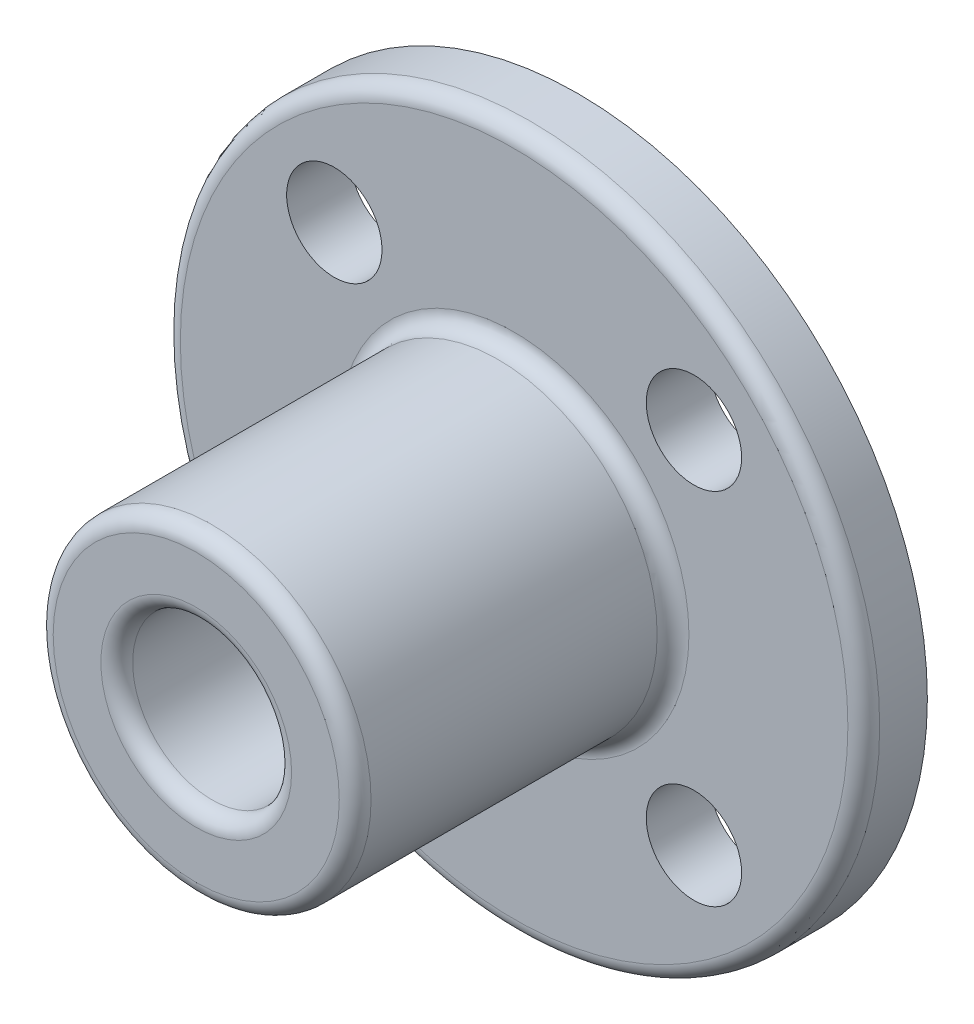
ISO-10303-21;
HEADER;
FILE_DESCRIPTION(('STEP AP214'),'2;1');
FILE_NAME('part.step','',(''),(''),'','','');
FILE_SCHEMA(('AUTOMOTIVE_DESIGN { 1 0 10303 214 1 1 1 1 }'));
ENDSEC;
DATA;
#1=APPLICATION_CONTEXT('core data for automotive mechanical design processes');
#2=APPLICATION_PROTOCOL_DEFINITION('international standard','automotive_design',2000,#1);
#3=PRODUCT_CONTEXT('',#1,'mechanical');
#4=PRODUCT('Part','Part','',(#3));
#5=PRODUCT_RELATED_PRODUCT_CATEGORY('part','',(#4));
#6=PRODUCT_DEFINITION_FORMATION('','',#4);
#7=PRODUCT_DEFINITION_CONTEXT('part definition',#1,'design');
#8=PRODUCT_DEFINITION('design','',#6,#7);
#9=PRODUCT_DEFINITION_SHAPE('','',#8);
#10=(LENGTH_UNIT() NAMED_UNIT(*) SI_UNIT(.MILLI.,.METRE.));
#11=(NAMED_UNIT(*) PLANE_ANGLE_UNIT() SI_UNIT($,.RADIAN.));
#12=(NAMED_UNIT(*) SI_UNIT($,.STERADIAN.) SOLID_ANGLE_UNIT());
#13=UNCERTAINTY_MEASURE_WITH_UNIT(LENGTH_MEASURE(1.E-05),#10,'distance_accuracy_value','');
#14=(GEOMETRIC_REPRESENTATION_CONTEXT(3) GLOBAL_UNCERTAINTY_ASSIGNED_CONTEXT((#13)) GLOBAL_UNIT_ASSIGNED_CONTEXT((#10,
#11,#12)) REPRESENTATION_CONTEXT('',''));
#15=CARTESIAN_POINT('',(0.,0.,0.));
#16=DIRECTION('',(0.,0.,1.));
#17=DIRECTION('',(1.,0.,0.));
#18=AXIS2_PLACEMENT_3D('',#15,#16,#17);
#19=CARTESIAN_POINT('',(0.,0.,2.));
#20=DIRECTION('',(0.,0.,1.));
#21=DIRECTION('',(1.,0.,0.));
#22=AXIS2_PLACEMENT_3D('',#19,#20,#21);
#23=PLANE('',#22);
#24=CARTESIAN_POINT('',(0.,0.,2.));
#25=DIRECTION('',(0.,0.,1.));
#26=DIRECTION('',(1.,0.,0.));
#27=AXIS2_PLACEMENT_3D('',#24,#25,#26);
#28=CIRCLE('',#27,10.5);
#29=CARTESIAN_POINT('',(10.5,0.,2.));
#30=VERTEX_POINT('',#29);
#31=EDGE_CURVE('E63',#30,#30,#28,.T.);
#32=ORIENTED_EDGE('',*,*,#31,.T.);
#33=EDGE_LOOP('',(#32));
#34=FACE_BOUND('',#33,.T.);
#35=CARTESIAN_POINT('',(0.,0.,2.));
#36=DIRECTION('',(0.,0.,1.));
#37=DIRECTION('',(1.,0.,0.));
#38=AXIS2_PLACEMENT_3D('',#35,#36,#37);
#39=CIRCLE('',#38,5.5);
#40=CARTESIAN_POINT('',(5.5,0.,2.));
#41=VERTEX_POINT('',#40);
#42=EDGE_CURVE('E66',#41,#41,#39,.F.);
#43=ORIENTED_EDGE('',*,*,#42,.T.);
#44=EDGE_LOOP('',(#43));
#45=FACE_BOUND('',#44,.T.);
#46=CARTESIAN_POINT('',(-5.65599974191922,-5.65770862800566,2.));
#47=DIRECTION('',(0.,0.,1.));
#48=DIRECTION('',(1.,0.,0.));
#49=AXIS2_PLACEMENT_3D('',#46,#47,#48);
#50=CIRCLE('',#49,1.5);
#51=CARTESIAN_POINT('',(-4.15599974191922,-5.65770862800566,2.));
#52=VERTEX_POINT('',#51);
#53=EDGE_CURVE('E91',#52,#52,#50,.T.);
#54=ORIENTED_EDGE('',*,*,#53,.F.);
#55=EDGE_LOOP('',(#54));
#56=FACE_BOUND('',#55,.T.);
#57=CARTESIAN_POINT('',(5.65599974191922,5.65770862800566,2.));
#58=DIRECTION('',(0.,0.,1.));
#59=DIRECTION('',(1.,0.,0.));
#60=AXIS2_PLACEMENT_3D('',#57,#58,#59);
#61=CIRCLE('',#60,1.5);
#62=CARTESIAN_POINT('',(7.15599974191922,5.65770862800566,2.));
#63=VERTEX_POINT('',#62);
#64=EDGE_CURVE('E79',#63,#63,#61,.T.);
#65=ORIENTED_EDGE('',*,*,#64,.F.);
#66=EDGE_LOOP('',(#65));
#67=FACE_BOUND('',#66,.T.);
#68=CARTESIAN_POINT('',(-5.65599974191922,5.65770862800566,2.));
#69=DIRECTION('',(0.,0.,1.));
#70=DIRECTION('',(1.,0.,0.));
#71=AXIS2_PLACEMENT_3D('',#68,#69,#70);
#72=CIRCLE('',#71,1.5);
#73=CARTESIAN_POINT('',(-4.15599974191922,5.65770862800566,2.));
#74=VERTEX_POINT('',#73);
#75=EDGE_CURVE('E75',#74,#74,#72,.T.);
#76=ORIENTED_EDGE('',*,*,#75,.F.);
#77=EDGE_LOOP('',(#76));
#78=FACE_BOUND('',#77,.T.);
#79=CARTESIAN_POINT('',(5.65599974191922,-5.65770862800566,2.));
#80=DIRECTION('',(0.,0.,1.));
#81=DIRECTION('',(1.,0.,0.));
#82=AXIS2_PLACEMENT_3D('',#79,#80,#81);
#83=CIRCLE('',#82,1.5);
#84=CARTESIAN_POINT('',(7.15599974191922,-5.65770862800566,2.));
#85=VERTEX_POINT('',#84);
#86=EDGE_CURVE('E85',#85,#85,#83,.T.);
#87=ORIENTED_EDGE('',*,*,#86,.F.);
#88=EDGE_LOOP('',(#87));
#89=FACE_BOUND('',#88,.T.);
#90=ADVANCED_FACE('F37',(#34,#45,#56,#67,#78,#89),#23,.T.);
#91=CARTESIAN_POINT('',(0.,0.,0.));
#92=DIRECTION('',(0.,0.,1.));
#93=DIRECTION('',(1.,0.,0.));
#94=AXIS2_PLACEMENT_3D('',#91,#92,#93);
#95=PLANE('',#94);
#96=CARTESIAN_POINT('',(0.,0.,0.));
#97=DIRECTION('',(0.,0.,1.));
#98=DIRECTION('',(1.,0.,0.));
#99=AXIS2_PLACEMENT_3D('',#96,#97,#98);
#100=CIRCLE('',#99,11.);
#101=CARTESIAN_POINT('',(11.,0.,0.));
#102=VERTEX_POINT('',#101);
#103=EDGE_CURVE('E69',#102,#102,#100,.T.);
#104=ORIENTED_EDGE('',*,*,#103,.F.);
#105=EDGE_LOOP('',(#104));
#106=FACE_BOUND('',#105,.T.);
#107=CARTESIAN_POINT('',(0.,0.,0.));
#108=DIRECTION('',(0.,0.,1.));
#109=DIRECTION('',(1.,0.,0.));
#110=AXIS2_PLACEMENT_3D('',#107,#108,#109);
#111=CIRCLE('',#110,2.5);
#112=CARTESIAN_POINT('',(2.5,0.,0.));
#113=VERTEX_POINT('',#112);
#114=EDGE_CURVE('E72',#113,#113,#111,.T.);
#115=ORIENTED_EDGE('',*,*,#114,.T.);
#116=EDGE_LOOP('',(#115));
#117=FACE_BOUND('',#116,.T.);
#118=CARTESIAN_POINT('',(-5.65599974191922,5.65770862800566,0.));
#119=DIRECTION('',(0.,0.,1.));
#120=DIRECTION('',(1.,0.,0.));
#121=AXIS2_PLACEMENT_3D('',#118,#119,#120);
#122=CIRCLE('',#121,1.5);
#123=CARTESIAN_POINT('',(-4.15599974191922,5.65770862800566,0.));
#124=VERTEX_POINT('',#123);
#125=EDGE_CURVE('E76',#124,#124,#122,.T.);
#126=ORIENTED_EDGE('',*,*,#125,.T.);
#127=EDGE_LOOP('',(#126));
#128=FACE_BOUND('',#127,.T.);
#129=CARTESIAN_POINT('',(5.65599974191922,5.65770862800566,0.));
#130=DIRECTION('',(0.,0.,1.));
#131=DIRECTION('',(1.,0.,0.));
#132=AXIS2_PLACEMENT_3D('',#129,#130,#131);
#133=CIRCLE('',#132,1.5);
#134=CARTESIAN_POINT('',(7.15599974191922,5.65770862800566,0.));
#135=VERTEX_POINT('',#134);
#136=EDGE_CURVE('E82',#135,#135,#133,.T.);
#137=ORIENTED_EDGE('',*,*,#136,.T.);
#138=EDGE_LOOP('',(#137));
#139=FACE_BOUND('',#138,.T.);
#140=CARTESIAN_POINT('',(5.65599974191922,-5.65770862800566,0.));
#141=DIRECTION('',(0.,0.,1.));
#142=DIRECTION('',(1.,0.,0.));
#143=AXIS2_PLACEMENT_3D('',#140,#141,#142);
#144=CIRCLE('',#143,1.5);
#145=CARTESIAN_POINT('',(7.15599974191922,-5.65770862800566,0.));
#146=VERTEX_POINT('',#145);
#147=EDGE_CURVE('E88',#146,#146,#144,.T.);
#148=ORIENTED_EDGE('',*,*,#147,.T.);
#149=EDGE_LOOP('',(#148));
#150=FACE_BOUND('',#149,.T.);
#151=CARTESIAN_POINT('',(-5.65599974191922,-5.65770862800566,0.));
#152=DIRECTION('',(0.,0.,1.));
#153=DIRECTION('',(1.,0.,0.));
#154=AXIS2_PLACEMENT_3D('',#151,#152,#153);
#155=CIRCLE('',#154,1.5);
#156=CARTESIAN_POINT('',(-4.15599974191922,-5.65770862800566,0.));
#157=VERTEX_POINT('',#156);
#158=EDGE_CURVE('E94',#157,#157,#155,.T.);
#159=ORIENTED_EDGE('',*,*,#158,.T.);
#160=EDGE_LOOP('',(#159));
#161=FACE_BOUND('',#160,.T.);
#162=ADVANCED_FACE('F105',(#106,#117,#128,#139,#150,#161),#95,.F.);
#163=CARTESIAN_POINT('',(0.,0.,2.));
#164=DIRECTION('',(0.,0.,-1.));
#165=DIRECTION('',(-1.,0.,0.));
#166=AXIS2_PLACEMENT_3D('',#163,#164,#165);
#167=CYLINDRICAL_SURFACE('',#166,11.);
#168=CARTESIAN_POINT('',(0.,0.,1.5));
#169=DIRECTION('',(0.,0.,1.));
#170=DIRECTION('',(1.,0.,0.));
#171=AXIS2_PLACEMENT_3D('',#168,#169,#170);
#172=CIRCLE('',#171,11.);
#173=CARTESIAN_POINT('',(11.,0.,1.5));
#174=VERTEX_POINT('',#173);
#175=EDGE_CURVE('E60',#174,#174,#172,.F.);
#176=ORIENTED_EDGE('',*,*,#175,.T.);
#177=EDGE_LOOP('',(#176));
#178=FACE_BOUND('',#177,.T.);
#179=ORIENTED_EDGE('',*,*,#103,.T.);
#180=EDGE_LOOP('',(#179));
#181=FACE_BOUND('',#180,.T.);
#182=ADVANCED_FACE('F123',(#178,#181),#167,.T.);
#183=CARTESIAN_POINT('',(0.,0.,2.));
#184=DIRECTION('',(0.,0.,-1.));
#185=DIRECTION('',(-1.,0.,0.));
#186=AXIS2_PLACEMENT_3D('',#183,#184,#185);
#187=CYLINDRICAL_SURFACE('',#186,2.5);
#188=CARTESIAN_POINT('',(0.,0.,11.5));
#189=DIRECTION('',(0.,0.,1.));
#190=DIRECTION('',(1.,0.,0.));
#191=AXIS2_PLACEMENT_3D('',#188,#189,#190);
#192=CIRCLE('',#191,2.5);
#193=CARTESIAN_POINT('',(2.5,0.,11.5));
#194=VERTEX_POINT('',#193);
#195=EDGE_CURVE('E10',#194,#194,#192,.T.);
#196=ORIENTED_EDGE('',*,*,#195,.T.);
#197=EDGE_LOOP('',(#196));
#198=FACE_BOUND('',#197,.T.);
#199=ORIENTED_EDGE('',*,*,#114,.F.);
#200=EDGE_LOOP('',(#199));
#201=FACE_BOUND('',#200,.T.);
#202=ADVANCED_FACE('F145',(#198,#201),#187,.F.);
#203=CARTESIAN_POINT('',(-5.65599974191922,5.65770862800566,2.));
#204=DIRECTION('',(0.,0.,-1.));
#205=DIRECTION('',(-1.,0.,0.));
#206=AXIS2_PLACEMENT_3D('',#203,#204,#205);
#207=CYLINDRICAL_SURFACE('',#206,1.5);
#208=ORIENTED_EDGE('',*,*,#75,.T.);
#209=EDGE_LOOP('',(#208));
#210=FACE_BOUND('',#209,.T.);
#211=ORIENTED_EDGE('',*,*,#125,.F.);
#212=EDGE_LOOP('',(#211));
#213=FACE_BOUND('',#212,.T.);
#214=ADVANCED_FACE('F141',(#210,#213),#207,.F.);
#215=CARTESIAN_POINT('',(5.65599974191922,5.65770862800566,2.));
#216=DIRECTION('',(0.,0.,-1.));
#217=DIRECTION('',(-1.,0.,0.));
#218=AXIS2_PLACEMENT_3D('',#215,#216,#217);
#219=CYLINDRICAL_SURFACE('',#218,1.5);
#220=ORIENTED_EDGE('',*,*,#64,.T.);
#221=EDGE_LOOP('',(#220));
#222=FACE_BOUND('',#221,.T.);
#223=ORIENTED_EDGE('',*,*,#136,.F.);
#224=EDGE_LOOP('',(#223));
#225=FACE_BOUND('',#224,.T.);
#226=ADVANCED_FACE('F117',(#222,#225),#219,.F.);
#227=CARTESIAN_POINT('',(5.65599974191922,-5.65770862800566,2.));
#228=DIRECTION('',(0.,0.,-1.));
#229=DIRECTION('',(-1.,0.,0.));
#230=AXIS2_PLACEMENT_3D('',#227,#228,#229);
#231=CYLINDRICAL_SURFACE('',#230,1.5);
#232=ORIENTED_EDGE('',*,*,#86,.T.);
#233=EDGE_LOOP('',(#232));
#234=FACE_BOUND('',#233,.T.);
#235=ORIENTED_EDGE('',*,*,#147,.F.);
#236=EDGE_LOOP('',(#235));
#237=FACE_BOUND('',#236,.T.);
#238=ADVANCED_FACE('F114',(#234,#237),#231,.F.);
#239=CARTESIAN_POINT('',(-5.65599974191922,-5.65770862800566,2.));
#240=DIRECTION('',(0.,0.,-1.));
#241=DIRECTION('',(-1.,0.,0.));
#242=AXIS2_PLACEMENT_3D('',#239,#240,#241);
#243=CYLINDRICAL_SURFACE('',#242,1.5);
#244=ORIENTED_EDGE('',*,*,#53,.T.);
#245=EDGE_LOOP('',(#244));
#246=FACE_BOUND('',#245,.T.);
#247=ORIENTED_EDGE('',*,*,#158,.F.);
#248=EDGE_LOOP('',(#247));
#249=FACE_BOUND('',#248,.T.);
#250=ADVANCED_FACE('F100',(#246,#249),#243,.F.);
#251=CARTESIAN_POINT('',(0.,0.,12.));
#252=DIRECTION('',(0.,0.,1.));
#253=DIRECTION('',(1.,0.,0.));
#254=AXIS2_PLACEMENT_3D('',#251,#252,#253);
#255=PLANE('',#254);
#256=CARTESIAN_POINT('',(0.,0.,12.));
#257=DIRECTION('',(0.,0.,1.));
#258=DIRECTION('',(1.,0.,0.));
#259=AXIS2_PLACEMENT_3D('',#256,#257,#258);
#260=CIRCLE('',#259,4.5);
#261=CARTESIAN_POINT('',(4.5,0.,12.));
#262=VERTEX_POINT('',#261);
#263=EDGE_CURVE('E52',#262,#262,#260,.T.);
#264=ORIENTED_EDGE('',*,*,#263,.T.);
#265=EDGE_LOOP('',(#264));
#266=FACE_BOUND('',#265,.T.);
#267=CARTESIAN_POINT('',(0.,0.,12.));
#268=DIRECTION('',(0.,0.,1.));
#269=DIRECTION('',(1.,0.,0.));
#270=AXIS2_PLACEMENT_3D('',#267,#268,#269);
#271=CIRCLE('',#270,3.);
#272=CARTESIAN_POINT('',(3.,0.,12.));
#273=VERTEX_POINT('',#272);
#274=EDGE_CURVE('E57',#273,#273,#271,.F.);
#275=ORIENTED_EDGE('',*,*,#274,.T.);
#276=EDGE_LOOP('',(#275));
#277=FACE_BOUND('',#276,.T.);
#278=ADVANCED_FACE('F128',(#266,#277),#255,.T.);
#279=CARTESIAN_POINT('',(0.,0.,12.));
#280=DIRECTION('',(0.,0.,-1.));
#281=DIRECTION('',(-1.,0.,0.));
#282=AXIS2_PLACEMENT_3D('',#279,#280,#281);
#283=CYLINDRICAL_SURFACE('',#282,5.);
#284=CARTESIAN_POINT('',(0.,0.,11.5));
#285=DIRECTION('',(0.,0.,1.));
#286=DIRECTION('',(1.,0.,0.));
#287=AXIS2_PLACEMENT_3D('',#284,#285,#286);
#288=CIRCLE('',#287,5.);
#289=CARTESIAN_POINT('',(5.,0.,11.5));
#290=VERTEX_POINT('',#289);
#291=EDGE_CURVE('E44',#290,#290,#288,.F.);
#292=ORIENTED_EDGE('',*,*,#291,.T.);
#293=EDGE_LOOP('',(#292));
#294=FACE_BOUND('',#293,.T.);
#295=CARTESIAN_POINT('',(0.,0.,2.5));
#296=DIRECTION('',(0.,0.,1.));
#297=DIRECTION('',(1.,0.,0.));
#298=AXIS2_PLACEMENT_3D('',#295,#296,#297);
#299=CIRCLE('',#298,5.);
#300=CARTESIAN_POINT('',(5.,0.,2.5));
#301=VERTEX_POINT('',#300);
#302=EDGE_CURVE('E48',#301,#301,#299,.T.);
#303=ORIENTED_EDGE('',*,*,#302,.T.);
#304=EDGE_LOOP('',(#303));
#305=FACE_BOUND('',#304,.T.);
#306=ADVANCED_FACE('F134',(#294,#305),#283,.T.);
#307=CARTESIAN_POINT('',(0.,0.,1.5));
#308=DIRECTION('',(0.,0.,1.));
#309=DIRECTION('',(1.,0.,0.));
#310=AXIS2_PLACEMENT_3D('',#307,#308,#309);
#311=TOROIDAL_SURFACE('',#310,10.5,0.5);
#312=ORIENTED_EDGE('',*,*,#175,.F.);
#313=EDGE_LOOP('',(#312));
#314=FACE_BOUND('',#313,.T.);
#315=ORIENTED_EDGE('',*,*,#31,.F.);
#316=EDGE_LOOP('',(#315));
#317=FACE_BOUND('',#316,.T.);
#318=ADVANCED_FACE('F152',(#314,#317),#311,.T.);
#319=CARTESIAN_POINT('',(0.,0.,11.5));
#320=DIRECTION('',(0.,0.,1.));
#321=DIRECTION('',(1.,0.,0.));
#322=AXIS2_PLACEMENT_3D('',#319,#320,#321);
#323=TOROIDAL_SURFACE('',#322,4.5,0.5);
#324=ORIENTED_EDGE('',*,*,#291,.F.);
#325=EDGE_LOOP('',(#324));
#326=FACE_BOUND('',#325,.T.);
#327=ORIENTED_EDGE('',*,*,#263,.F.);
#328=EDGE_LOOP('',(#327));
#329=FACE_BOUND('',#328,.T.);
#330=ADVANCED_FACE('F155',(#326,#329),#323,.T.);
#331=CARTESIAN_POINT('',(0.,0.,11.5));
#332=DIRECTION('',(0.,0.,1.));
#333=DIRECTION('',(1.,0.,0.));
#334=AXIS2_PLACEMENT_3D('',#331,#332,#333);
#335=TOROIDAL_SURFACE('',#334,3.,0.5);
#336=ORIENTED_EDGE('',*,*,#274,.F.);
#337=EDGE_LOOP('',(#336));
#338=FACE_BOUND('',#337,.T.);
#339=ORIENTED_EDGE('',*,*,#195,.F.);
#340=EDGE_LOOP('',(#339));
#341=FACE_BOUND('',#340,.T.);
#342=ADVANCED_FACE('F158',(#338,#341),#335,.T.);
#343=CARTESIAN_POINT('',(0.,0.,2.5));
#344=DIRECTION('',(0.,0.,1.));
#345=DIRECTION('',(1.,0.,0.));
#346=AXIS2_PLACEMENT_3D('',#343,#344,#345);
#347=TOROIDAL_SURFACE('',#346,5.5,0.5);
#348=ORIENTED_EDGE('',*,*,#42,.F.);
#349=EDGE_LOOP('',(#348));
#350=FACE_BOUND('',#349,.T.);
#351=ORIENTED_EDGE('',*,*,#302,.F.);
#352=EDGE_LOOP('',(#351));
#353=FACE_BOUND('',#352,.T.);
#354=ADVANCED_FACE('F39',(#350,#353),#347,.F.);
#355=CLOSED_SHELL('',(#90,#162,#182,#202,#214,#226,#238,#250,#278,#306,#318,#330,#342,#354));
#356=MANIFOLD_SOLID_BREP('B2',#355);
#357=ADVANCED_BREP_SHAPE_REPRESENTATION('',(#18,#356),#14);
#358=SHAPE_DEFINITION_REPRESENTATION(#9,#357);
ENDSEC;
END-ISO-10303-21;
